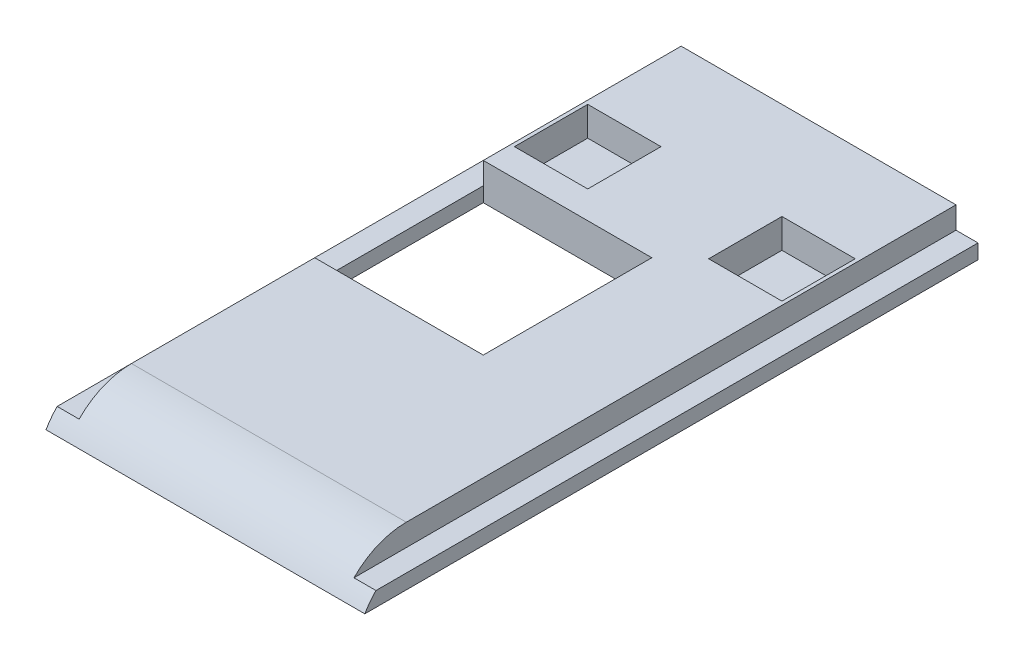
ISO-10303-21;
HEADER;
FILE_DESCRIPTION(('STEP AP214'),'2;1');
FILE_NAME('part.step','',(''),(''),'','','');
FILE_SCHEMA(('AUTOMOTIVE_DESIGN { 1 0 10303 214 1 1 1 1 }'));
ENDSEC;
DATA;
#1=APPLICATION_CONTEXT('core data for automotive mechanical design processes');
#2=APPLICATION_PROTOCOL_DEFINITION('international standard','automotive_design',2000,#1);
#3=PRODUCT_CONTEXT('',#1,'mechanical');
#4=PRODUCT('Part','Part','',(#3));
#5=PRODUCT_RELATED_PRODUCT_CATEGORY('part','',(#4));
#6=PRODUCT_DEFINITION_FORMATION('','',#4);
#7=PRODUCT_DEFINITION_CONTEXT('part definition',#1,'design');
#8=PRODUCT_DEFINITION('design','',#6,#7);
#9=PRODUCT_DEFINITION_SHAPE('','',#8);
#10=(LENGTH_UNIT() NAMED_UNIT(*) SI_UNIT(.MILLI.,.METRE.));
#11=(NAMED_UNIT(*) PLANE_ANGLE_UNIT() SI_UNIT($,.RADIAN.));
#12=(NAMED_UNIT(*) SI_UNIT($,.STERADIAN.) SOLID_ANGLE_UNIT());
#13=UNCERTAINTY_MEASURE_WITH_UNIT(LENGTH_MEASURE(1.E-05),#10,'distance_accuracy_value','');
#14=(GEOMETRIC_REPRESENTATION_CONTEXT(3) GLOBAL_UNCERTAINTY_ASSIGNED_CONTEXT((#13)) GLOBAL_UNIT_ASSIGNED_CONTEXT((#10,
#11,#12)) REPRESENTATION_CONTEXT('',''));
#15=CARTESIAN_POINT('',(0.,0.,0.));
#16=DIRECTION('',(0.,0.,1.));
#17=DIRECTION('',(1.,0.,0.));
#18=AXIS2_PLACEMENT_3D('',#15,#16,#17);
#19=CARTESIAN_POINT('',(1.2,0.8,-27.));
#20=DIRECTION('',(1.,0.,0.));
#21=DIRECTION('',(0.,0.,-1.));
#22=AXIS2_PLACEMENT_3D('',#19,#20,#21);
#23=PLANE('',#22);
#24=DIRECTION('',(0.,0.,-1.));
#25=VECTOR('',#24,1.);
#26=CARTESIAN_POINT('',(1.2,0.8,-27.));
#27=LINE('',#26,#25);
#28=CARTESIAN_POINT('',(1.2,0.8,-23.2));
#29=VERTEX_POINT('',#28);
#30=CARTESIAN_POINT('',(1.2,0.8,-34.));
#31=VERTEX_POINT('',#30);
#32=EDGE_CURVE('E343',#29,#31,#27,.T.);
#33=ORIENTED_EDGE('',*,*,#32,.F.);
#34=DIRECTION('',(0.,1.,0.));
#35=VECTOR('',#34,1.);
#36=CARTESIAN_POINT('',(1.2,-5.,-23.2));
#37=LINE('',#36,#35);
#38=CARTESIAN_POINT('',(1.2,2.,-23.2));
#39=VERTEX_POINT('',#38);
#40=EDGE_CURVE('E287',#29,#39,#37,.T.);
#41=ORIENTED_EDGE('',*,*,#40,.T.);
#42=DIRECTION('',(0.,0.,1.));
#43=VECTOR('',#42,1.);
#44=CARTESIAN_POINT('',(1.2,2.,0.));
#45=LINE('',#44,#43);
#46=CARTESIAN_POINT('',(1.2,2.,-34.));
#47=VERTEX_POINT('',#46);
#48=EDGE_CURVE('E388',#47,#39,#45,.T.);
#49=ORIENTED_EDGE('',*,*,#48,.F.);
#50=DIRECTION('',(0.,-1.,0.));
#51=VECTOR('',#50,1.);
#52=CARTESIAN_POINT('',(1.2,2.,-34.));
#53=LINE('',#52,#51);
#54=EDGE_CURVE('E315',#47,#31,#53,.T.);
#55=ORIENTED_EDGE('',*,*,#54,.T.);
#56=EDGE_LOOP('',(#33,#41,#49,#55));
#57=FACE_BOUND('',#56,.T.);
#58=ADVANCED_FACE('F39',(#57),#23,.F.);
#59=CARTESIAN_POINT('',(0.,2.,0.));
#60=DIRECTION('',(1.,0.,0.));
#61=DIRECTION('',(0.,0.,-1.));
#62=AXIS2_PLACEMENT_3D('',#59,#60,#61);
#63=PLANE('',#62);
#64=DIRECTION('',(0.,0.,1.));
#65=VECTOR('',#64,1.);
#66=CARTESIAN_POINT('',(0.,0.8,-27.));
#67=LINE('',#66,#65);
#68=CARTESIAN_POINT('',(0.,0.8,-34.));
#69=VERTEX_POINT('',#68);
#70=CARTESIAN_POINT('',(0.,0.8,-1.14342862858287));
#71=VERTEX_POINT('',#70);
#72=EDGE_CURVE('E340',#69,#71,#67,.T.);
#73=ORIENTED_EDGE('',*,*,#72,.F.);
#74=DIRECTION('',(0.,-1.,0.));
#75=VECTOR('',#74,1.);
#76=CARTESIAN_POINT('',(0.,0.8,-34.));
#77=LINE('',#76,#75);
#78=CARTESIAN_POINT('',(0.,0.,-34.));
#79=VERTEX_POINT('',#78);
#80=EDGE_CURVE('E332',#69,#79,#77,.T.);
#81=ORIENTED_EDGE('',*,*,#80,.T.);
#82=DIRECTION('',(0.,0.,-1.));
#83=VECTOR('',#82,1.);
#84=CARTESIAN_POINT('',(0.,0.,0.));
#85=LINE('',#84,#83);
#86=CARTESIAN_POINT('',(0.,0.,-0.535898384862245));
#87=VERTEX_POINT('',#86);
#88=EDGE_CURVE('E365',#87,#79,#85,.T.);
#89=ORIENTED_EDGE('',*,*,#88,.F.);
#90=CARTESIAN_POINT('',(0.,-2.,-4.));
#91=DIRECTION('',(1.,0.,0.));
#92=DIRECTION('',(0.,0.,-1.));
#93=AXIS2_PLACEMENT_3D('',#90,#91,#92);
#94=CIRCLE('',#93,4.);
#95=EDGE_CURVE('E379',#87,#71,#94,.F.);
#96=ORIENTED_EDGE('',*,*,#95,.T.);
#97=EDGE_LOOP('',(#73,#81,#89,#96));
#98=FACE_BOUND('',#97,.T.);
#99=ADVANCED_FACE('F404',(#98),#63,.F.);
#100=CARTESIAN_POINT('',(17.4,2.,0.));
#101=DIRECTION('',(-1.,0.,0.));
#102=DIRECTION('',(0.,0.,1.));
#103=AXIS2_PLACEMENT_3D('',#100,#101,#102);
#104=PLANE('',#103);
#105=DIRECTION('',(0.,0.,1.));
#106=VECTOR('',#105,1.);
#107=CARTESIAN_POINT('',(17.4,0.,0.));
#108=LINE('',#107,#106);
#109=CARTESIAN_POINT('',(17.4,0.,-34.));
#110=VERTEX_POINT('',#109);
#111=CARTESIAN_POINT('',(17.4,0.,-0.535898384862245));
#112=VERTEX_POINT('',#111);
#113=EDGE_CURVE('E368',#110,#112,#108,.T.);
#114=ORIENTED_EDGE('',*,*,#113,.F.);
#115=DIRECTION('',(0.,-1.,0.));
#116=VECTOR('',#115,1.);
#117=CARTESIAN_POINT('',(17.4,0.8,-34.));
#118=LINE('',#117,#116);
#119=CARTESIAN_POINT('',(17.4,0.8,-34.));
#120=VERTEX_POINT('',#119);
#121=EDGE_CURVE('E310',#120,#110,#118,.T.);
#122=ORIENTED_EDGE('',*,*,#121,.F.);
#123=DIRECTION('',(0.,0.,-1.));
#124=VECTOR('',#123,1.);
#125=CARTESIAN_POINT('',(17.4,0.8,-27.));
#126=LINE('',#125,#124);
#127=CARTESIAN_POINT('',(17.4,0.8,-1.14342862858287));
#128=VERTEX_POINT('',#127);
#129=EDGE_CURVE('E351',#128,#120,#126,.T.);
#130=ORIENTED_EDGE('',*,*,#129,.F.);
#131=CARTESIAN_POINT('',(17.4,-2.,-4.));
#132=DIRECTION('',(-1.,0.,0.));
#133=DIRECTION('',(0.,0.,1.));
#134=AXIS2_PLACEMENT_3D('',#131,#132,#133);
#135=CIRCLE('',#134,4.);
#136=EDGE_CURVE('E376',#128,#112,#135,.F.);
#137=ORIENTED_EDGE('',*,*,#136,.T.);
#138=EDGE_LOOP('',(#114,#122,#130,#137));
#139=FACE_BOUND('',#138,.T.);
#140=ADVANCED_FACE('F417',(#139),#104,.F.);
#141=CARTESIAN_POINT('',(0.,-2.,-4.));
#142=DIRECTION('',(1.,0.,0.));
#143=DIRECTION('',(0.,0.,-1.));
#144=AXIS2_PLACEMENT_3D('',#141,#142,#143);
#145=CYLINDRICAL_SURFACE('',#144,4.);
#146=CARTESIAN_POINT('',(1.2,-2.,-4.));
#147=DIRECTION('',(1.,0.,0.));
#148=DIRECTION('',(0.,0.,-1.));
#149=AXIS2_PLACEMENT_3D('',#146,#147,#148);
#150=CIRCLE('',#149,4.);
#151=CARTESIAN_POINT('',(1.2,0.8,-1.14342862858287));
#152=VERTEX_POINT('',#151);
#153=CARTESIAN_POINT('',(1.2,2.,-4.));
#154=VERTEX_POINT('',#153);
#155=EDGE_CURVE('E361',#152,#154,#150,.F.);
#156=ORIENTED_EDGE('',*,*,#155,.F.);
#157=DIRECTION('',(1.,0.,0.));
#158=VECTOR('',#157,1.);
#159=CARTESIAN_POINT('',(0.,0.8,-1.14342862858286));
#160=LINE('',#159,#158);
#161=EDGE_CURVE('E48',#152,#71,#160,.F.);
#162=ORIENTED_EDGE('',*,*,#161,.T.);
#163=ORIENTED_EDGE('',*,*,#95,.F.);
#164=DIRECTION('',(1.,0.,0.));
#165=VECTOR('',#164,1.);
#166=CARTESIAN_POINT('',(0.,0.,-0.535898384862245));
#167=LINE('',#166,#165);
#168=EDGE_CURVE('E383',#87,#112,#167,.T.);
#169=ORIENTED_EDGE('',*,*,#168,.T.);
#170=ORIENTED_EDGE('',*,*,#136,.F.);
#171=DIRECTION('',(1.,0.,0.));
#172=VECTOR('',#171,1.);
#173=CARTESIAN_POINT('',(0.,0.8,-1.14342862858286));
#174=LINE('',#173,#172);
#175=CARTESIAN_POINT('',(16.2,0.8,-1.14342862858287));
#176=VERTEX_POINT('',#175);
#177=EDGE_CURVE('E392',#176,#128,#174,.T.);
#178=ORIENTED_EDGE('',*,*,#177,.F.);
#179=CARTESIAN_POINT('',(16.2,-2.,-4.));
#180=DIRECTION('',(-1.,0.,0.));
#181=DIRECTION('',(0.,0.,1.));
#182=AXIS2_PLACEMENT_3D('',#179,#180,#181);
#183=CIRCLE('',#182,4.);
#184=CARTESIAN_POINT('',(16.2,2.,-4.00000000000001));
#185=VERTEX_POINT('',#184);
#186=EDGE_CURVE('E349',#185,#176,#183,.F.);
#187=ORIENTED_EDGE('',*,*,#186,.F.);
#188=DIRECTION('',(1.,0.,0.));
#189=VECTOR('',#188,1.);
#190=CARTESIAN_POINT('',(0.,2.,-4.));
#191=LINE('',#190,#189);
#192=EDGE_CURVE('E372',#154,#185,#191,.T.);
#193=ORIENTED_EDGE('',*,*,#192,.F.);
#194=EDGE_LOOP('',(#156,#162,#163,#169,#170,#178,#187,#193));
#195=FACE_BOUND('',#194,.T.);
#196=ADVANCED_FACE('F41',(#195),#145,.T.);
#197=CARTESIAN_POINT('',(0.,2.,0.));
#198=DIRECTION('',(0.,-1.,0.));
#199=DIRECTION('',(0.,0.,-1.));
#200=AXIS2_PLACEMENT_3D('',#197,#198,#199);
#201=PLANE('',#200);
#202=DIRECTION('',(1.,0.,0.));
#203=VECTOR('',#202,1.);
#204=CARTESIAN_POINT('',(1.4,2.,-24.7));
#205=LINE('',#204,#203);
#206=CARTESIAN_POINT('',(1.4,2.,-24.7));
#207=VERTEX_POINT('',#206);
#208=CARTESIAN_POINT('',(5.4,2.,-24.7));
#209=VERTEX_POINT('',#208);
#210=EDGE_CURVE('E219',#207,#209,#205,.T.);
#211=ORIENTED_EDGE('',*,*,#210,.F.);
#212=DIRECTION('',(0.,0.,1.));
#213=VECTOR('',#212,1.);
#214=CARTESIAN_POINT('',(1.4,2.,-28.7));
#215=LINE('',#214,#213);
#216=CARTESIAN_POINT('',(1.4,2.,-28.7));
#217=VERTEX_POINT('',#216);
#218=EDGE_CURVE('E55',#217,#207,#215,.T.);
#219=ORIENTED_EDGE('',*,*,#218,.F.);
#220=DIRECTION('',(-1.,0.,0.));
#221=VECTOR('',#220,1.);
#222=CARTESIAN_POINT('',(1.4,2.,-28.7));
#223=LINE('',#222,#221);
#224=CARTESIAN_POINT('',(5.4,2.,-28.7));
#225=VERTEX_POINT('',#224);
#226=EDGE_CURVE('E206',#225,#217,#223,.T.);
#227=ORIENTED_EDGE('',*,*,#226,.F.);
#228=DIRECTION('',(0.,0.,-1.));
#229=VECTOR('',#228,1.);
#230=CARTESIAN_POINT('',(5.4,2.,-28.7));
#231=LINE('',#230,#229);
#232=EDGE_CURVE('E210',#209,#225,#231,.T.);
#233=ORIENTED_EDGE('',*,*,#232,.F.);
#234=EDGE_LOOP('',(#211,#219,#227,#233));
#235=FACE_BOUND('',#234,.T.);
#236=DIRECTION('',(1.,0.,0.));
#237=VECTOR('',#236,1.);
#238=CARTESIAN_POINT('',(12.,2.,-24.7));
#239=LINE('',#238,#237);
#240=CARTESIAN_POINT('',(12.,2.,-24.7));
#241=VERTEX_POINT('',#240);
#242=CARTESIAN_POINT('',(16.,2.,-24.7));
#243=VERTEX_POINT('',#242);
#244=EDGE_CURVE('E255',#241,#243,#239,.T.);
#245=ORIENTED_EDGE('',*,*,#244,.F.);
#246=DIRECTION('',(0.,0.,1.));
#247=VECTOR('',#246,1.);
#248=CARTESIAN_POINT('',(12.,2.,-28.7));
#249=LINE('',#248,#247);
#250=CARTESIAN_POINT('',(12.,2.,-28.7));
#251=VERTEX_POINT('',#250);
#252=EDGE_CURVE('E63',#251,#241,#249,.T.);
#253=ORIENTED_EDGE('',*,*,#252,.F.);
#254=DIRECTION('',(-1.,0.,0.));
#255=VECTOR('',#254,1.);
#256=CARTESIAN_POINT('',(12.,2.,-28.7));
#257=LINE('',#256,#255);
#258=CARTESIAN_POINT('',(16.,2.,-28.7));
#259=VERTEX_POINT('',#258);
#260=EDGE_CURVE('E240',#259,#251,#257,.T.);
#261=ORIENTED_EDGE('',*,*,#260,.F.);
#262=DIRECTION('',(0.,0.,-1.));
#263=VECTOR('',#262,1.);
#264=CARTESIAN_POINT('',(16.,2.,-28.7));
#265=LINE('',#264,#263);
#266=EDGE_CURVE('E259',#243,#259,#265,.T.);
#267=ORIENTED_EDGE('',*,*,#266,.F.);
#268=EDGE_LOOP('',(#245,#253,#261,#267));
#269=FACE_BOUND('',#268,.T.);
#270=ORIENTED_EDGE('',*,*,#48,.T.);
#271=DIRECTION('',(-1.,0.,0.));
#272=VECTOR('',#271,1.);
#273=CARTESIAN_POINT('',(1.2,2.,-23.2));
#274=LINE('',#273,#272);
#275=CARTESIAN_POINT('',(10.4,2.,-23.2));
#276=VERTEX_POINT('',#275);
#277=EDGE_CURVE('E283',#276,#39,#274,.T.);
#278=ORIENTED_EDGE('',*,*,#277,.F.);
#279=DIRECTION('',(0.,0.,-1.));
#280=VECTOR('',#279,1.);
#281=CARTESIAN_POINT('',(10.4,2.,-23.2));
#282=LINE('',#281,#280);
#283=CARTESIAN_POINT('',(10.4,2.,-14.));
#284=VERTEX_POINT('',#283);
#285=EDGE_CURVE('E279',#284,#276,#282,.T.);
#286=ORIENTED_EDGE('',*,*,#285,.F.);
#287=DIRECTION('',(1.,0.,0.));
#288=VECTOR('',#287,1.);
#289=CARTESIAN_POINT('',(1.2,2.,-14.));
#290=LINE('',#289,#288);
#291=CARTESIAN_POINT('',(1.2,2.,-14.));
#292=VERTEX_POINT('',#291);
#293=EDGE_CURVE('E229',#292,#284,#290,.T.);
#294=ORIENTED_EDGE('',*,*,#293,.F.);
#295=EDGE_CURVE('E387',#292,#154,#45,.T.);
#296=ORIENTED_EDGE('',*,*,#295,.T.);
#297=ORIENTED_EDGE('',*,*,#192,.T.);
#298=DIRECTION('',(0.,0.,1.));
#299=VECTOR('',#298,1.);
#300=CARTESIAN_POINT('',(16.2,2.,-27.));
#301=LINE('',#300,#299);
#302=CARTESIAN_POINT('',(16.2,2.,-34.));
#303=VERTEX_POINT('',#302);
#304=EDGE_CURVE('E324',#303,#185,#301,.T.);
#305=ORIENTED_EDGE('',*,*,#304,.F.);
#306=DIRECTION('',(-1.,0.,0.));
#307=VECTOR('',#306,1.);
#308=CARTESIAN_POINT('',(16.2,2.,-34.));
#309=LINE('',#308,#307);
#310=EDGE_CURVE('E320',#303,#47,#309,.T.);
#311=ORIENTED_EDGE('',*,*,#310,.T.);
#312=EDGE_LOOP('',(#270,#278,#286,#294,#296,#297,#305,#311));
#313=FACE_BOUND('',#312,.T.);
#314=ADVANCED_FACE('F428',(#235,#269,#313),#201,.F.);
#315=CARTESIAN_POINT('',(0.,0.,0.));
#316=DIRECTION('',(0.,-1.,0.));
#317=DIRECTION('',(0.,0.,-1.));
#318=AXIS2_PLACEMENT_3D('',#315,#316,#317);
#319=PLANE('',#318);
#320=DIRECTION('',(0.,0.,-1.));
#321=VECTOR('',#320,1.);
#322=CARTESIAN_POINT('',(1.2,0.,0.));
#323=LINE('',#322,#321);
#324=CARTESIAN_POINT('',(1.2,0.,-14.));
#325=VERTEX_POINT('',#324);
#326=CARTESIAN_POINT('',(1.2,0.,-23.2));
#327=VERTEX_POINT('',#326);
#328=EDGE_CURVE('E301',#325,#327,#323,.T.);
#329=ORIENTED_EDGE('',*,*,#328,.F.);
#330=DIRECTION('',(-1.,0.,0.));
#331=VECTOR('',#330,1.);
#332=CARTESIAN_POINT('',(0.,0.,-14.));
#333=LINE('',#332,#331);
#334=CARTESIAN_POINT('',(10.4,0.,-14.));
#335=VERTEX_POINT('',#334);
#336=EDGE_CURVE('E304',#335,#325,#333,.T.);
#337=ORIENTED_EDGE('',*,*,#336,.F.);
#338=DIRECTION('',(0.,0.,1.));
#339=VECTOR('',#338,1.);
#340=CARTESIAN_POINT('',(10.4,0.,0.));
#341=LINE('',#340,#339);
#342=CARTESIAN_POINT('',(10.4,0.,-23.2));
#343=VERTEX_POINT('',#342);
#344=EDGE_CURVE('E11',#343,#335,#341,.T.);
#345=ORIENTED_EDGE('',*,*,#344,.F.);
#346=DIRECTION('',(1.,0.,0.));
#347=VECTOR('',#346,1.);
#348=CARTESIAN_POINT('',(0.,0.,-23.2));
#349=LINE('',#348,#347);
#350=EDGE_CURVE('E307',#327,#343,#349,.T.);
#351=ORIENTED_EDGE('',*,*,#350,.F.);
#352=EDGE_LOOP('',(#329,#337,#345,#351));
#353=FACE_BOUND('',#352,.T.);
#354=ORIENTED_EDGE('',*,*,#88,.T.);
#355=DIRECTION('',(-1.,0.,0.));
#356=VECTOR('',#355,1.);
#357=CARTESIAN_POINT('',(17.4,0.,-34.));
#358=LINE('',#357,#356);
#359=EDGE_CURVE('E328',#110,#79,#358,.T.);
#360=ORIENTED_EDGE('',*,*,#359,.F.);
#361=ORIENTED_EDGE('',*,*,#113,.T.);
#362=ORIENTED_EDGE('',*,*,#168,.F.);
#363=EDGE_LOOP('',(#354,#360,#361,#362));
#364=FACE_BOUND('',#363,.T.);
#365=ADVANCED_FACE('F409',(#353,#364),#319,.T.);
#366=CARTESIAN_POINT('',(16.2,0.8,-27.));
#367=DIRECTION('',(-1.,0.,0.));
#368=DIRECTION('',(0.,0.,1.));
#369=AXIS2_PLACEMENT_3D('',#366,#367,#368);
#370=PLANE('',#369);
#371=ORIENTED_EDGE('',*,*,#186,.T.);
#372=DIRECTION('',(0.,0.,1.));
#373=VECTOR('',#372,1.);
#374=CARTESIAN_POINT('',(16.2,0.8,-27.));
#375=LINE('',#374,#373);
#376=CARTESIAN_POINT('',(16.2,0.8,-34.));
#377=VERTEX_POINT('',#376);
#378=EDGE_CURVE('E344',#377,#176,#375,.T.);
#379=ORIENTED_EDGE('',*,*,#378,.F.);
#380=DIRECTION('',(0.,-1.,0.));
#381=VECTOR('',#380,1.);
#382=CARTESIAN_POINT('',(16.2,2.,-34.));
#383=LINE('',#382,#381);
#384=EDGE_CURVE('E311',#303,#377,#383,.T.);
#385=ORIENTED_EDGE('',*,*,#384,.F.);
#386=ORIENTED_EDGE('',*,*,#304,.T.);
#387=EDGE_LOOP('',(#371,#379,#385,#386));
#388=FACE_BOUND('',#387,.T.);
#389=ADVANCED_FACE('F425',(#388),#370,.F.);
#390=CARTESIAN_POINT('',(0.,0.8,0.));
#391=DIRECTION('',(0.,-1.,0.));
#392=DIRECTION('',(0.,0.,-1.));
#393=AXIS2_PLACEMENT_3D('',#390,#391,#392);
#394=PLANE('',#393);
#395=ORIENTED_EDGE('',*,*,#177,.T.);
#396=ORIENTED_EDGE('',*,*,#129,.T.);
#397=DIRECTION('',(-1.,0.,0.));
#398=VECTOR('',#397,1.);
#399=CARTESIAN_POINT('',(17.4,0.8,-34.));
#400=LINE('',#399,#398);
#401=EDGE_CURVE('E316',#120,#377,#400,.T.);
#402=ORIENTED_EDGE('',*,*,#401,.T.);
#403=ORIENTED_EDGE('',*,*,#378,.T.);
#404=EDGE_LOOP('',(#395,#396,#402,#403));
#405=FACE_BOUND('',#404,.T.);
#406=ADVANCED_FACE('F422',(#405),#394,.F.);
#407=ORIENTED_EDGE('',*,*,#295,.F.);
#408=DIRECTION('',(0.,1.,0.));
#409=VECTOR('',#408,1.);
#410=CARTESIAN_POINT('',(1.2,-5.,-14.));
#411=LINE('',#410,#409);
#412=CARTESIAN_POINT('',(1.2,0.8,-14.));
#413=VERTEX_POINT('',#412);
#414=EDGE_CURVE('E286',#413,#292,#411,.T.);
#415=ORIENTED_EDGE('',*,*,#414,.F.);
#416=EDGE_CURVE('E345',#152,#413,#27,.T.);
#417=ORIENTED_EDGE('',*,*,#416,.F.);
#418=ORIENTED_EDGE('',*,*,#155,.T.);
#419=EDGE_LOOP('',(#407,#415,#417,#418));
#420=FACE_BOUND('',#419,.T.);
#421=ADVANCED_FACE('F435',(#420),#23,.F.);
#422=CARTESIAN_POINT('',(0.,0.8,0.));
#423=DIRECTION('',(0.,1.,0.));
#424=DIRECTION('',(0.,0.,1.));
#425=AXIS2_PLACEMENT_3D('',#422,#423,#424);
#426=PLANE('',#425);
#427=ORIENTED_EDGE('',*,*,#416,.T.);
#428=EDGE_CURVE('E350',#413,#29,#27,.T.);
#429=ORIENTED_EDGE('',*,*,#428,.T.);
#430=ORIENTED_EDGE('',*,*,#32,.T.);
#431=EDGE_CURVE('E336',#31,#69,#400,.T.);
#432=ORIENTED_EDGE('',*,*,#431,.T.);
#433=ORIENTED_EDGE('',*,*,#72,.T.);
#434=ORIENTED_EDGE('',*,*,#161,.F.);
#435=EDGE_LOOP('',(#427,#429,#430,#432,#433,#434));
#436=FACE_BOUND('',#435,.T.);
#437=ADVANCED_FACE('F437',(#436),#426,.T.);
#438=CARTESIAN_POINT('',(0.,0.,-34.));
#439=DIRECTION('',(0.,0.,-1.));
#440=DIRECTION('',(-1.,0.,0.));
#441=AXIS2_PLACEMENT_3D('',#438,#439,#440);
#442=PLANE('',#441);
#443=ORIENTED_EDGE('',*,*,#384,.T.);
#444=ORIENTED_EDGE('',*,*,#401,.F.);
#445=ORIENTED_EDGE('',*,*,#121,.T.);
#446=ORIENTED_EDGE('',*,*,#359,.T.);
#447=ORIENTED_EDGE('',*,*,#80,.F.);
#448=ORIENTED_EDGE('',*,*,#431,.F.);
#449=ORIENTED_EDGE('',*,*,#54,.F.);
#450=ORIENTED_EDGE('',*,*,#310,.F.);
#451=EDGE_LOOP('',(#443,#444,#445,#446,#447,#448,#449,#450));
#452=FACE_BOUND('',#451,.T.);
#453=ADVANCED_FACE('F411',(#452),#442,.T.);
#454=CARTESIAN_POINT('',(1.2,-5.,-23.2));
#455=DIRECTION('',(-1.,0.,0.));
#456=DIRECTION('',(0.,0.,1.));
#457=AXIS2_PLACEMENT_3D('',#454,#455,#456);
#458=PLANE('',#457);
#459=ORIENTED_EDGE('',*,*,#328,.T.);
#460=EDGE_CURVE('E291',#327,#29,#37,.T.);
#461=ORIENTED_EDGE('',*,*,#460,.T.);
#462=ORIENTED_EDGE('',*,*,#428,.F.);
#463=EDGE_CURVE('E298',#325,#413,#411,.T.);
#464=ORIENTED_EDGE('',*,*,#463,.F.);
#465=EDGE_LOOP('',(#459,#461,#462,#464));
#466=FACE_BOUND('',#465,.T.);
#467=ADVANCED_FACE('F451',(#466),#458,.F.);
#468=CARTESIAN_POINT('',(1.2,-5.,-23.2));
#469=DIRECTION('',(0.,0.,-1.));
#470=DIRECTION('',(-1.,0.,0.));
#471=AXIS2_PLACEMENT_3D('',#468,#469,#470);
#472=PLANE('',#471);
#473=ORIENTED_EDGE('',*,*,#350,.T.);
#474=DIRECTION('',(0.,1.,0.));
#475=VECTOR('',#474,1.);
#476=CARTESIAN_POINT('',(10.4,-5.,-23.2));
#477=LINE('',#476,#475);
#478=EDGE_CURVE('E292',#343,#276,#477,.T.);
#479=ORIENTED_EDGE('',*,*,#478,.T.);
#480=ORIENTED_EDGE('',*,*,#277,.T.);
#481=ORIENTED_EDGE('',*,*,#40,.F.);
#482=ORIENTED_EDGE('',*,*,#460,.F.);
#483=EDGE_LOOP('',(#473,#479,#480,#481,#482));
#484=FACE_BOUND('',#483,.T.);
#485=ADVANCED_FACE('F458',(#484),#472,.F.);
#486=CARTESIAN_POINT('',(10.4,-5.,-23.2));
#487=DIRECTION('',(1.,0.,0.));
#488=DIRECTION('',(0.,0.,-1.));
#489=AXIS2_PLACEMENT_3D('',#486,#487,#488);
#490=PLANE('',#489);
#491=ORIENTED_EDGE('',*,*,#344,.T.);
#492=DIRECTION('',(0.,1.,0.));
#493=VECTOR('',#492,1.);
#494=CARTESIAN_POINT('',(10.4,-5.,-14.));
#495=LINE('',#494,#493);
#496=EDGE_CURVE('E295',#335,#284,#495,.T.);
#497=ORIENTED_EDGE('',*,*,#496,.T.);
#498=ORIENTED_EDGE('',*,*,#285,.T.);
#499=ORIENTED_EDGE('',*,*,#478,.F.);
#500=EDGE_LOOP('',(#491,#497,#498,#499));
#501=FACE_BOUND('',#500,.T.);
#502=ADVANCED_FACE('F461',(#501),#490,.F.);
#503=CARTESIAN_POINT('',(1.2,-5.,-14.));
#504=DIRECTION('',(0.,0.,1.));
#505=DIRECTION('',(1.,0.,0.));
#506=AXIS2_PLACEMENT_3D('',#503,#504,#505);
#507=PLANE('',#506);
#508=ORIENTED_EDGE('',*,*,#336,.T.);
#509=ORIENTED_EDGE('',*,*,#463,.T.);
#510=ORIENTED_EDGE('',*,*,#414,.T.);
#511=ORIENTED_EDGE('',*,*,#293,.T.);
#512=ORIENTED_EDGE('',*,*,#496,.F.);
#513=EDGE_LOOP('',(#508,#509,#510,#511,#512));
#514=FACE_BOUND('',#513,.T.);
#515=ADVANCED_FACE('F448',(#514),#507,.F.);
#516=CARTESIAN_POINT('',(12.,0.4,-28.7));
#517=DIRECTION('',(-1.,0.,0.));
#518=DIRECTION('',(0.,0.,1.));
#519=AXIS2_PLACEMENT_3D('',#516,#517,#518);
#520=PLANE('',#519);
#521=ORIENTED_EDGE('',*,*,#252,.T.);
#522=DIRECTION('',(0.,1.,0.));
#523=VECTOR('',#522,1.);
#524=CARTESIAN_POINT('',(12.,0.4,-24.7));
#525=LINE('',#524,#523);
#526=CARTESIAN_POINT('',(12.,0.4,-24.7));
#527=VERTEX_POINT('',#526);
#528=EDGE_CURVE('E252',#527,#241,#525,.T.);
#529=ORIENTED_EDGE('',*,*,#528,.F.);
#530=DIRECTION('',(0.,0.,1.));
#531=VECTOR('',#530,1.);
#532=CARTESIAN_POINT('',(12.,0.4,-28.7));
#533=LINE('',#532,#531);
#534=CARTESIAN_POINT('',(12.,0.4,-28.7));
#535=VERTEX_POINT('',#534);
#536=EDGE_CURVE('E235',#535,#527,#533,.T.);
#537=ORIENTED_EDGE('',*,*,#536,.F.);
#538=DIRECTION('',(0.,1.,0.));
#539=VECTOR('',#538,1.);
#540=CARTESIAN_POINT('',(12.,0.4,-28.7));
#541=LINE('',#540,#539);
#542=EDGE_CURVE('E220',#535,#251,#541,.T.);
#543=ORIENTED_EDGE('',*,*,#542,.T.);
#544=EDGE_LOOP('',(#521,#529,#537,#543));
#545=FACE_BOUND('',#544,.T.);
#546=ADVANCED_FACE('F564',(#545),#520,.F.);
#547=CARTESIAN_POINT('',(12.,0.4,-28.7));
#548=DIRECTION('',(0.,0.,-1.));
#549=DIRECTION('',(-1.,0.,0.));
#550=AXIS2_PLACEMENT_3D('',#547,#548,#549);
#551=PLANE('',#550);
#552=ORIENTED_EDGE('',*,*,#260,.T.);
#553=ORIENTED_EDGE('',*,*,#542,.F.);
#554=DIRECTION('',(-1.,0.,0.));
#555=VECTOR('',#554,1.);
#556=CARTESIAN_POINT('',(12.,0.4,-28.7));
#557=LINE('',#556,#555);
#558=CARTESIAN_POINT('',(16.,0.4,-28.7));
#559=VERTEX_POINT('',#558);
#560=EDGE_CURVE('E248',#559,#535,#557,.T.);
#561=ORIENTED_EDGE('',*,*,#560,.F.);
#562=DIRECTION('',(0.,1.,0.));
#563=VECTOR('',#562,1.);
#564=CARTESIAN_POINT('',(16.,0.4,-28.7));
#565=LINE('',#564,#563);
#566=EDGE_CURVE('E268',#559,#259,#565,.T.);
#567=ORIENTED_EDGE('',*,*,#566,.T.);
#568=EDGE_LOOP('',(#552,#553,#561,#567));
#569=FACE_BOUND('',#568,.T.);
#570=ADVANCED_FACE('F571',(#569),#551,.F.);
#571=CARTESIAN_POINT('',(16.,0.4,-28.7));
#572=DIRECTION('',(1.,0.,0.));
#573=DIRECTION('',(0.,0.,-1.));
#574=AXIS2_PLACEMENT_3D('',#571,#572,#573);
#575=PLANE('',#574);
#576=ORIENTED_EDGE('',*,*,#266,.T.);
#577=ORIENTED_EDGE('',*,*,#566,.F.);
#578=DIRECTION('',(0.,0.,-1.));
#579=VECTOR('',#578,1.);
#580=CARTESIAN_POINT('',(16.,0.4,-28.7));
#581=LINE('',#580,#579);
#582=CARTESIAN_POINT('',(16.,0.4,-24.7));
#583=VERTEX_POINT('',#582);
#584=EDGE_CURVE('E244',#583,#559,#581,.T.);
#585=ORIENTED_EDGE('',*,*,#584,.F.);
#586=DIRECTION('',(0.,1.,0.));
#587=VECTOR('',#586,1.);
#588=CARTESIAN_POINT('',(16.,0.4,-24.7));
#589=LINE('',#588,#587);
#590=EDGE_CURVE('E271',#583,#243,#589,.T.);
#591=ORIENTED_EDGE('',*,*,#590,.T.);
#592=EDGE_LOOP('',(#576,#577,#585,#591));
#593=FACE_BOUND('',#592,.T.);
#594=ADVANCED_FACE('F579',(#593),#575,.F.);
#595=CARTESIAN_POINT('',(12.,0.4,-24.7));
#596=DIRECTION('',(0.,0.,1.));
#597=DIRECTION('',(1.,0.,0.));
#598=AXIS2_PLACEMENT_3D('',#595,#596,#597);
#599=PLANE('',#598);
#600=ORIENTED_EDGE('',*,*,#244,.T.);
#601=ORIENTED_EDGE('',*,*,#590,.F.);
#602=DIRECTION('',(1.,0.,0.));
#603=VECTOR('',#602,1.);
#604=CARTESIAN_POINT('',(12.,0.4,-24.7));
#605=LINE('',#604,#603);
#606=EDGE_CURVE('E239',#527,#583,#605,.T.);
#607=ORIENTED_EDGE('',*,*,#606,.F.);
#608=ORIENTED_EDGE('',*,*,#528,.T.);
#609=EDGE_LOOP('',(#600,#601,#607,#608));
#610=FACE_BOUND('',#609,.T.);
#611=ADVANCED_FACE('F588',(#610),#599,.F.);
#612=CARTESIAN_POINT('',(0.,0.4,0.));
#613=DIRECTION('',(0.,1.,0.));
#614=DIRECTION('',(0.,0.,1.));
#615=AXIS2_PLACEMENT_3D('',#612,#613,#614);
#616=PLANE('',#615);
#617=ORIENTED_EDGE('',*,*,#536,.T.);
#618=ORIENTED_EDGE('',*,*,#606,.T.);
#619=ORIENTED_EDGE('',*,*,#584,.T.);
#620=ORIENTED_EDGE('',*,*,#560,.T.);
#621=EDGE_LOOP('',(#617,#618,#619,#620));
#622=FACE_BOUND('',#621,.T.);
#623=ADVANCED_FACE('F597',(#622),#616,.T.);
#624=CARTESIAN_POINT('',(1.4,0.4,-28.7));
#625=DIRECTION('',(-1.,0.,0.));
#626=DIRECTION('',(0.,0.,1.));
#627=AXIS2_PLACEMENT_3D('',#624,#625,#626);
#628=PLANE('',#627);
#629=ORIENTED_EDGE('',*,*,#218,.T.);
#630=DIRECTION('',(0.,1.,0.));
#631=VECTOR('',#630,1.);
#632=CARTESIAN_POINT('',(1.4,0.4,-24.7));
#633=LINE('',#632,#631);
#634=CARTESIAN_POINT('',(1.4,0.4,-24.7));
#635=VERTEX_POINT('',#634);
#636=EDGE_CURVE('E181',#635,#207,#633,.T.);
#637=ORIENTED_EDGE('',*,*,#636,.F.);
#638=DIRECTION('',(0.,0.,1.));
#639=VECTOR('',#638,1.);
#640=CARTESIAN_POINT('',(1.4,0.4,-28.7));
#641=LINE('',#640,#639);
#642=CARTESIAN_POINT('',(1.4,0.4,-28.7));
#643=VERTEX_POINT('',#642);
#644=EDGE_CURVE('E185',#643,#635,#641,.T.);
#645=ORIENTED_EDGE('',*,*,#644,.F.);
#646=DIRECTION('',(0.,1.,0.));
#647=VECTOR('',#646,1.);
#648=CARTESIAN_POINT('',(1.4,0.4,-28.7));
#649=LINE('',#648,#647);
#650=EDGE_CURVE('E226',#643,#217,#649,.T.);
#651=ORIENTED_EDGE('',*,*,#650,.T.);
#652=EDGE_LOOP('',(#629,#637,#645,#651));
#653=FACE_BOUND('',#652,.T.);
#654=ADVANCED_FACE('F183',(#653),#628,.F.);
#655=CARTESIAN_POINT('',(1.4,0.4,-28.7));
#656=DIRECTION('',(0.,0.,-1.));
#657=DIRECTION('',(-1.,0.,0.));
#658=AXIS2_PLACEMENT_3D('',#655,#656,#657);
#659=PLANE('',#658);
#660=ORIENTED_EDGE('',*,*,#226,.T.);
#661=ORIENTED_EDGE('',*,*,#650,.F.);
#662=DIRECTION('',(-1.,0.,0.));
#663=VECTOR('',#662,1.);
#664=CARTESIAN_POINT('',(1.4,0.4,-28.7));
#665=LINE('',#664,#663);
#666=CARTESIAN_POINT('',(5.4,0.4,-28.7));
#667=VERTEX_POINT('',#666);
#668=EDGE_CURVE('E192',#667,#643,#665,.T.);
#669=ORIENTED_EDGE('',*,*,#668,.F.);
#670=DIRECTION('',(0.,1.,0.));
#671=VECTOR('',#670,1.);
#672=CARTESIAN_POINT('',(5.4,0.4,-28.7));
#673=LINE('',#672,#671);
#674=EDGE_CURVE('E230',#667,#225,#673,.T.);
#675=ORIENTED_EDGE('',*,*,#674,.T.);
#676=EDGE_LOOP('',(#660,#661,#669,#675));
#677=FACE_BOUND('',#676,.T.);
#678=ADVANCED_FACE('F614',(#677),#659,.F.);
#679=CARTESIAN_POINT('',(5.4,0.4,-28.7));
#680=DIRECTION('',(1.,0.,0.));
#681=DIRECTION('',(0.,0.,-1.));
#682=AXIS2_PLACEMENT_3D('',#679,#680,#681);
#683=PLANE('',#682);
#684=ORIENTED_EDGE('',*,*,#232,.T.);
#685=ORIENTED_EDGE('',*,*,#674,.F.);
#686=DIRECTION('',(0.,0.,-1.));
#687=VECTOR('',#686,1.);
#688=CARTESIAN_POINT('',(5.4,0.4,-28.7));
#689=LINE('',#688,#687);
#690=CARTESIAN_POINT('',(5.4,0.4,-24.7));
#691=VERTEX_POINT('',#690);
#692=EDGE_CURVE('E201',#691,#667,#689,.T.);
#693=ORIENTED_EDGE('',*,*,#692,.F.);
#694=DIRECTION('',(0.,1.,0.));
#695=VECTOR('',#694,1.);
#696=CARTESIAN_POINT('',(5.4,0.4,-24.7));
#697=LINE('',#696,#695);
#698=EDGE_CURVE('E191',#691,#209,#697,.T.);
#699=ORIENTED_EDGE('',*,*,#698,.T.);
#700=EDGE_LOOP('',(#684,#685,#693,#699));
#701=FACE_BOUND('',#700,.T.);
#702=ADVANCED_FACE('F622',(#701),#683,.F.);
#703=CARTESIAN_POINT('',(1.4,0.4,-24.7));
#704=DIRECTION('',(0.,0.,1.));
#705=DIRECTION('',(1.,0.,0.));
#706=AXIS2_PLACEMENT_3D('',#703,#704,#705);
#707=PLANE('',#706);
#708=ORIENTED_EDGE('',*,*,#210,.T.);
#709=ORIENTED_EDGE('',*,*,#698,.F.);
#710=DIRECTION('',(1.,0.,0.));
#711=VECTOR('',#710,1.);
#712=CARTESIAN_POINT('',(1.4,0.4,-24.7));
#713=LINE('',#712,#711);
#714=EDGE_CURVE('E195',#635,#691,#713,.T.);
#715=ORIENTED_EDGE('',*,*,#714,.F.);
#716=ORIENTED_EDGE('',*,*,#636,.T.);
#717=EDGE_LOOP('',(#708,#709,#715,#716));
#718=FACE_BOUND('',#717,.T.);
#719=ADVANCED_FACE('F196',(#718),#707,.F.);
#720=CARTESIAN_POINT('',(0.,0.4,0.));
#721=DIRECTION('',(0.,1.,0.));
#722=DIRECTION('',(0.,0.,1.));
#723=AXIS2_PLACEMENT_3D('',#720,#721,#722);
#724=PLANE('',#723);
#725=ORIENTED_EDGE('',*,*,#644,.T.);
#726=ORIENTED_EDGE('',*,*,#714,.T.);
#727=ORIENTED_EDGE('',*,*,#692,.T.);
#728=ORIENTED_EDGE('',*,*,#668,.T.);
#729=EDGE_LOOP('',(#725,#726,#727,#728));
#730=FACE_BOUND('',#729,.T.);
#731=ADVANCED_FACE('F203',(#730),#724,.T.);
#732=CLOSED_SHELL('',(#58,#99,#140,#196,#314,#365,#389,#406,#421,#437,#453,#467,#485,#502,#515,
#546,#570,#594,#611,#623,#654,#678,#702,#719,#731));
#733=MANIFOLD_SOLID_BREP('B2',#732);
#734=ADVANCED_BREP_SHAPE_REPRESENTATION('',(#18,#733),#14);
#735=SHAPE_DEFINITION_REPRESENTATION(#9,#734);
ENDSEC;
END-ISO-10303-21;
